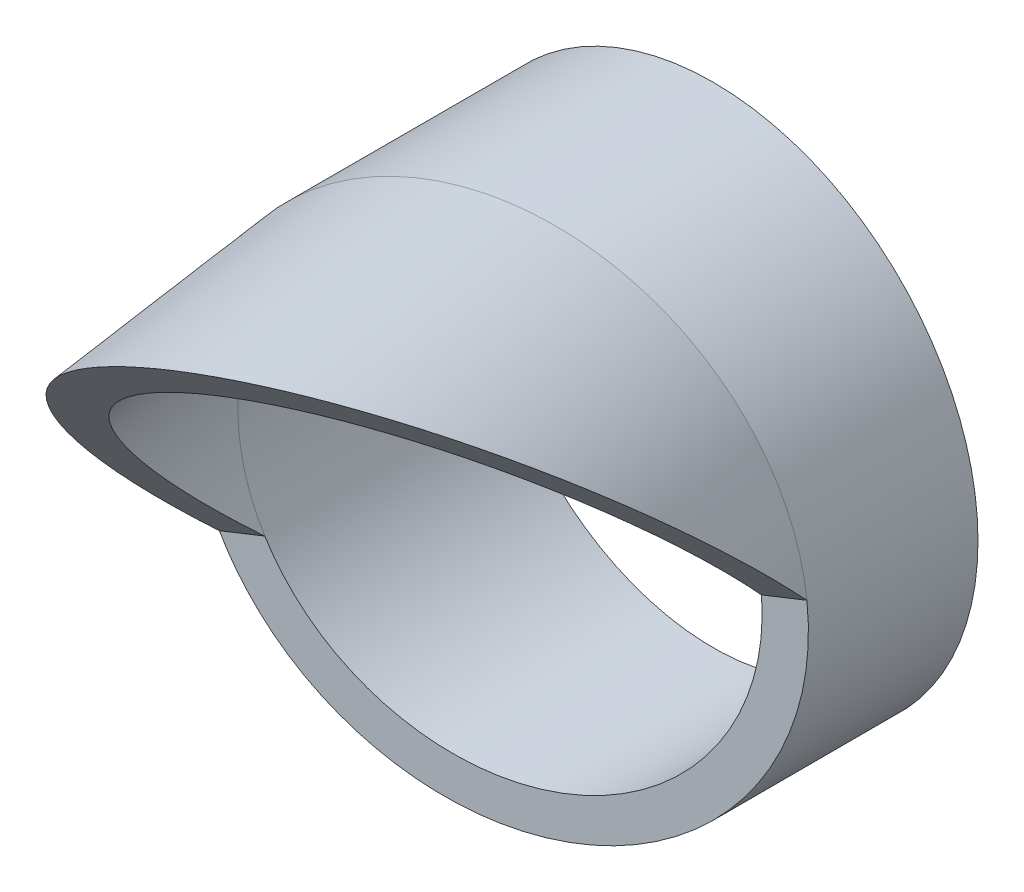
ISO-10303-21;
HEADER;
FILE_DESCRIPTION(('STEP AP214'),'2;1');
FILE_NAME('part.step','',(''),(''),'','','');
FILE_SCHEMA(('AUTOMOTIVE_DESIGN { 1 0 10303 214 1 1 1 1 }'));
ENDSEC;
DATA;
#1=APPLICATION_CONTEXT('core data for automotive mechanical design processes');
#2=APPLICATION_PROTOCOL_DEFINITION('international standard','automotive_design',2000,#1);
#3=PRODUCT_CONTEXT('',#1,'mechanical');
#4=PRODUCT('Part','Part','',(#3));
#5=PRODUCT_RELATED_PRODUCT_CATEGORY('part','',(#4));
#6=PRODUCT_DEFINITION_FORMATION('','',#4);
#7=PRODUCT_DEFINITION_CONTEXT('part definition',#1,'design');
#8=PRODUCT_DEFINITION('design','',#6,#7);
#9=PRODUCT_DEFINITION_SHAPE('','',#8);
#10=(LENGTH_UNIT() NAMED_UNIT(*) SI_UNIT(.MILLI.,.METRE.));
#11=(NAMED_UNIT(*) PLANE_ANGLE_UNIT() SI_UNIT($,.RADIAN.));
#12=(NAMED_UNIT(*) SI_UNIT($,.STERADIAN.) SOLID_ANGLE_UNIT());
#13=UNCERTAINTY_MEASURE_WITH_UNIT(LENGTH_MEASURE(1.E-05),#10,'distance_accuracy_value','');
#14=(GEOMETRIC_REPRESENTATION_CONTEXT(3) GLOBAL_UNCERTAINTY_ASSIGNED_CONTEXT((#13)) GLOBAL_UNIT_ASSIGNED_CONTEXT((#10,
#11,#12)) REPRESENTATION_CONTEXT('',''));
#15=CARTESIAN_POINT('',(0.,0.,0.));
#16=DIRECTION('',(0.,0.,1.));
#17=DIRECTION('',(1.,0.,0.));
#18=AXIS2_PLACEMENT_3D('',#15,#16,#17);
#19=CARTESIAN_POINT('',(159.020263581372,24.1294285061991,-220.702273573353));
#20=DIRECTION('',(-0.16261150339795,-0.0243941865043981,-0.986388575880442));
#21=DIRECTION('',(0.,-0.999694333772214,0.0247232486483956));
#22=AXIS2_PLACEMENT_3D('',#19,#20,#21);
#23=PLANE('',#22);
#24=DIRECTION('',(-0.946649738355044,-0.27803952145627,0.162936482657183));
#25=VECTOR('',#24,1.);
#26=CARTESIAN_POINT('',(0.910270861354675,-3.14163625511007,-193.962548779948));
#27=LINE('',#26,#25);
#28=CARTESIAN_POINT('',(-15.0845281279932,-7.83945222294123,-191.209538682822));
#29=VERTEX_POINT('',#28);
#30=CARTESIAN_POINT('',(-18.0093362344554,-8.69849460506376,-190.706123400479));
#31=VERTEX_POINT('',#30);
#32=EDGE_CURVE('E65',#29,#31,#27,.T.);
#33=ORIENTED_EDGE('',*,*,#32,.T.);
#34=CARTESIAN_POINT('',(0.,0.,-193.890180897479));
#35=DIRECTION('',(-0.16261150339795,-0.0243941865043981,-0.986388575880442));
#36=DIRECTION('',(0.975473354913011,0.146335766243945,-0.164431071797738));
#37=AXIS2_PLACEMENT_3D('',#34,#35,#36);
#38=ELLIPSE('',#37,20.2759850317084,20.);
#39=CARTESIAN_POINT('',(19.8528113921094,2.42195785044465,-197.222921441156));
#40=VERTEX_POINT('',#39);
#41=EDGE_CURVE('E69',#40,#31,#38,.T.);
#42=ORIENTED_EDGE('',*,*,#41,.F.);
#43=CARTESIAN_POINT('',(16.9280032856473,1.56291546832214,-196.719506158813));
#44=VERTEX_POINT('',#43);
#45=EDGE_CURVE('E73',#40,#44,#27,.T.);
#46=ORIENTED_EDGE('',*,*,#45,.T.);
#47=CARTESIAN_POINT('',(0.,0.,-193.890180897479));
#48=DIRECTION('',(-0.16261150339795,-0.0243941865043981,-0.986388575880442));
#49=DIRECTION('',(0.975473354913011,0.146335766243945,-0.164431071797738));
#50=AXIS2_PLACEMENT_3D('',#47,#48,#49);
#51=ELLIPSE('',#50,17.2345872769521,17.);
#52=EDGE_CURVE('E79',#44,#29,#51,.T.);
#53=ORIENTED_EDGE('',*,*,#52,.T.);
#54=EDGE_LOOP('',(#33,#42,#46,#53));
#55=FACE_BOUND('',#54,.T.);
#56=ADVANCED_FACE('F33',(#55),#23,.F.);
#57=CARTESIAN_POINT('',(0.,0.,-210.));
#58=DIRECTION('',(0.,0.,-1.));
#59=DIRECTION('',(1.,0.,0.));
#60=AXIS2_PLACEMENT_3D('',#57,#58,#59);
#61=PLANE('',#60);
#62=CARTESIAN_POINT('',(0.,0.,-210.));
#63=DIRECTION('',(0.,0.,-1.));
#64=DIRECTION('',(1.,0.,0.));
#65=AXIS2_PLACEMENT_3D('',#62,#63,#64);
#66=CIRCLE('',#65,20.);
#67=CARTESIAN_POINT('',(20.,0.,-210.));
#68=VERTEX_POINT('',#67);
#69=EDGE_CURVE('E11',#68,#68,#66,.T.);
#70=ORIENTED_EDGE('',*,*,#69,.T.);
#71=EDGE_LOOP('',(#70));
#72=FACE_BOUND('',#71,.T.);
#73=CARTESIAN_POINT('',(0.,0.,-210.));
#74=DIRECTION('',(0.,0.,-1.));
#75=DIRECTION('',(1.,0.,0.));
#76=AXIS2_PLACEMENT_3D('',#73,#74,#75);
#77=CIRCLE('',#76,17.);
#78=CARTESIAN_POINT('',(17.,0.,-210.));
#79=VERTEX_POINT('',#78);
#80=EDGE_CURVE('E41',#79,#79,#77,.T.);
#81=ORIENTED_EDGE('',*,*,#80,.F.);
#82=EDGE_LOOP('',(#81));
#83=FACE_BOUND('',#82,.T.);
#84=ADVANCED_FACE('F94',(#72,#83),#61,.T.);
#85=CARTESIAN_POINT('',(0.,0.,-210.));
#86=DIRECTION('',(0.,0.,1.));
#87=DIRECTION('',(-1.,0.,0.));
#88=AXIS2_PLACEMENT_3D('',#85,#86,#87);
#89=CYLINDRICAL_SURFACE('',#88,20.);
#90=ORIENTED_EDGE('',*,*,#69,.F.);
#91=EDGE_LOOP('',(#90));
#92=FACE_BOUND('',#91,.T.);
#93=ORIENTED_EDGE('',*,*,#41,.T.);
#94=EDGE_CURVE('E63',#31,#40,#38,.T.);
#95=ORIENTED_EDGE('',*,*,#94,.T.);
#96=EDGE_LOOP('',(#93,#95));
#97=FACE_BOUND('',#96,.T.);
#98=ADVANCED_FACE('F35',(#92,#97),#89,.T.);
#99=CARTESIAN_POINT('',(0.,0.,-210.));
#100=DIRECTION('',(0.,0.,1.));
#101=DIRECTION('',(-1.,0.,0.));
#102=AXIS2_PLACEMENT_3D('',#99,#100,#101);
#103=CYLINDRICAL_SURFACE('',#102,17.);
#104=ORIENTED_EDGE('',*,*,#80,.T.);
#105=EDGE_LOOP('',(#104));
#106=FACE_BOUND('',#105,.T.);
#107=ORIENTED_EDGE('',*,*,#52,.F.);
#108=EDGE_CURVE('E78',#29,#44,#51,.T.);
#109=ORIENTED_EDGE('',*,*,#108,.F.);
#110=EDGE_LOOP('',(#107,#109));
#111=FACE_BOUND('',#110,.T.);
#112=ADVANCED_FACE('F91',(#106,#111),#103,.F.);
#113=CARTESIAN_POINT('',(11.6426036892652,1.7465667548604,-123.267063635657));
#114=DIRECTION('',(0.16261150339795,0.0243941865043981,0.986388575880442));
#115=DIRECTION('',(0.97547335491301,0.146335766243947,-0.164431071797738));
#116=AXIS2_PLACEMENT_3D('',#113,#114,#115);
#117=ELLIPSE('',#116,17.2345872769521,17.);
#118=DIRECTION('',(-0.16261150339795,-0.0243941865043981,-0.986388575880442));
#119=VECTOR('',#118,1.);
#120=SURFACE_OF_LINEAR_EXTRUSION('',#117,#119);
#121=CARTESIAN_POINT('',(-15.0845281279933,-7.83945222294125,-191.209538682822));
#122=CARTESIAN_POINT('',(-15.1612871559029,-7.60982072736148,-190.956322702624));
#123=CARTESIAN_POINT('',(-15.232746514392,-7.37805778490534,-190.703471758801));
#124=CARTESIAN_POINT('',(-15.3650949812381,-6.91052197809102,-190.198727567382));
#125=CARTESIAN_POINT('',(-15.4259844312446,-6.6747492436113,-189.946834289088));
#126=CARTESIAN_POINT('',(-15.592835515124,-5.96182868254459,-189.192966400034));
#127=CARTESIAN_POINT('',(-15.6829977560138,-5.47902487003654,-188.692744622895));
#128=CARTESIAN_POINT('',(-15.8210783631236,-4.50060333773084,-187.699185164218));
#129=CARTESIAN_POINT('',(-15.868999204065,-4.00498637034588,-187.205847081063));
#130=CARTESIAN_POINT('',(-15.922254119359,-3.0028190814749,-186.227999660757));
#131=CARTESIAN_POINT('',(-15.927587197789,-2.49626850458216,-185.743490530337));
#132=CARTESIAN_POINT('',(-15.8949860998728,-1.47409772179016,-184.785382125877));
#133=CARTESIAN_POINT('',(-15.8570428829237,-0.958475642974025,-184.311785152522));
#134=CARTESIAN_POINT('',(-15.7368875187638,0.0796918860778796,-183.377996132474));
#135=CARTESIAN_POINT('',(-15.6546780266053,0.602236919247628,-182.917803283559));
#136=CARTESIAN_POINT('',(-15.4446273352371,1.65232854250528,-182.013267064877));
#137=CARTESIAN_POINT('',(-15.3167659946653,2.17987724001986,-181.568930786277));
#138=CARTESIAN_POINT('',(-15.0137435513342,3.23736060342348,-180.699350427098));
#139=CARTESIAN_POINT('',(-14.8385751180095,3.76729562656551,-180.27410931737));
#140=CARTESIAN_POINT('',(-14.4399606658589,4.82397599651774,-179.448467451121));
#141=CARTESIAN_POINT('',(-14.2167522642605,5.35072437312303,-179.047956490908));
#142=CARTESIAN_POINT('',(-13.7195027496257,6.39982821453472,-178.274074107531));
#143=CARTESIAN_POINT('',(-13.4454914610039,6.92218606973304,-177.900686939117));
#144=CARTESIAN_POINT('',(-12.8929395495552,7.87450959023015,-177.24389089397));
#145=CARTESIAN_POINT('',(-12.6222965247528,8.305756495543,-176.955695659321));
#146=CARTESIAN_POINT('',(-12.0418973119752,9.159672940856,-176.405134056145));
#147=CARTESIAN_POINT('',(-11.732085631783,9.58232930423376,-176.142805291366));
#148=CARTESIAN_POINT('',(-11.1153005476024,10.3605504738459,-175.68071903837));
#149=CARTESIAN_POINT('',(-10.8131395706409,10.7177241336275,-175.477256813521));
#150=CARTESIAN_POINT('',(-10.1781564578294,11.4189452839543,-175.096673113593));
#151=CARTESIAN_POINT('',(-9.84532507882441,11.7629887729864,-174.919559621567));
#152=CARTESIAN_POINT('',(-9.14938788479223,12.4338723000489,-174.595379203276));
#153=CARTESIAN_POINT('',(-8.78630659824536,12.7607259324973,-174.448288260448));
#154=CARTESIAN_POINT('',(-8.2197746562536,13.2348395614639,-174.25293401351));
#155=CARTESIAN_POINT('',(-8.02730497183945,13.3901641730573,-174.192035786239));
#156=CARTESIAN_POINT('',(-7.635158391571,13.6949437167719,-174.079080840661));
#157=CARTESIAN_POINT('',(-7.43547973360226,13.8443971948935,-174.027026302033));
#158=CARTESIAN_POINT('',(-6.93536458773089,14.2043341985136,-173.910340378622));
#159=CARTESIAN_POINT('',(-6.63099133829881,14.4111199666548,-173.851006311768));
#160=CARTESIAN_POINT('',(-6.00878749966731,14.8087090317113,-173.753627234234));
#161=CARTESIAN_POINT('',(-5.69096005941402,14.9995160376504,-173.715577271331));
#162=CARTESIAN_POINT('',(-5.04358489445133,15.3631143379302,-173.661916958458));
#163=CARTESIAN_POINT('',(-4.71404560018038,15.5359182526138,-173.646290789684));
#164=CARTESIAN_POINT('',(-4.04503877552471,15.861790088766,-173.638305931259));
#165=CARTESIAN_POINT('',(-3.70557101619056,16.0148575546731,-173.645947778586));
#166=CARTESIAN_POINT('',(-3.01771078875665,16.3001639723234,-173.685085495143));
#167=CARTESIAN_POINT('',(-2.66928794146475,16.4323167632501,-173.716677087189));
#168=CARTESIAN_POINT('',(-1.96753615035512,16.6736952750359,-173.803896544597));
#169=CARTESIAN_POINT('',(-1.61420721510919,16.7829210359472,-173.85952436797));
#170=CARTESIAN_POINT('',(-0.905498153477816,16.9775176641538,-173.994409905649));
#171=CARTESIAN_POINT('',(-0.550118005519053,17.0628882800879,-174.073667868928));
#172=CARTESIAN_POINT('',(0.159824285620206,17.2093191323935,-174.254951310848));
#173=CARTESIAN_POINT('',(0.51438644622412,17.2703798914166,-174.356976299933));
#174=CARTESIAN_POINT('',(1.19974580243548,17.3654196533928,-174.576067376226));
#175=CARTESIAN_POINT('',(1.53074084850884,17.4007496649581,-174.691937024612));
#176=CARTESIAN_POINT('',(2.18751352856145,17.4502197644824,-174.9414870005));
#177=CARTESIAN_POINT('',(2.51329149933997,17.4643612258128,-175.075166173035));
#178=CARTESIAN_POINT('',(3.15798699603002,17.4721277431897,-175.358952110279));
#179=CARTESIAN_POINT('',(3.47690180008594,17.4657448051186,-175.509065253915));
#180=CARTESIAN_POINT('',(4.10629198212578,17.4333385769174,-175.824172216427));
#181=CARTESIAN_POINT('',(4.4167657358072,17.4073115340207,-175.989168873313));
#182=CARTESIAN_POINT('',(5.13054742873233,17.3247914602107,-176.390086329226));
#183=CARTESIAN_POINT('',(5.53009159294359,17.2610109129039,-176.631242977437));
#184=CARTESIAN_POINT('',(6.30991526959753,17.1029383600173,-177.133894102092));
#185=CARTESIAN_POINT('',(6.69018835721479,17.008636255188,-177.395395288535));
#186=CARTESIAN_POINT('',(7.4303318011825,16.7922020585684,-177.935669432241));
#187=CARTESIAN_POINT('',(7.79018780110574,16.6700506799525,-178.214454261295));
#188=CARTESIAN_POINT('',(8.48836779710209,16.4006568036998,-178.786178984248));
#189=CARTESIAN_POINT('',(8.8266963287434,16.2534196155311,-179.079115873451));
#190=CARTESIAN_POINT('',(9.58884807068831,15.8843786040723,-179.774570896888));
#191=CARTESIAN_POINT('',(10.0044153420226,15.6539411143142,-180.181577162692));
#192=CARTESIAN_POINT('',(10.7967427494077,15.1586895391893,-181.010779709015));
#193=CARTESIAN_POINT('',(11.1735461976943,14.8939145851528,-181.43295830902));
#194=CARTESIAN_POINT('',(11.8891454060059,14.334476728832,-182.288594605332));
#195=CARTESIAN_POINT('',(12.227975968502,14.0398416732005,-182.722041517669));
#196=CARTESIAN_POINT('',(12.8688661915242,13.4241952805671,-183.597430868772));
#197=CARTESIAN_POINT('',(13.1709157783734,13.1031767577283,-184.03937559674));
#198=CARTESIAN_POINT('',(13.7387116702788,12.4383556863261,-184.928552915414));
#199=CARTESIAN_POINT('',(14.0044900638168,12.0945736814576,-185.375780446832));
#200=CARTESIAN_POINT('',(14.500817387675,11.3867550409157,-186.27360105769));
#201=CARTESIAN_POINT('',(14.7313690634157,11.0227199866984,-186.724193871979));
#202=CARTESIAN_POINT('',(15.1578627373145,10.2768705823322,-187.626669119958));
#203=CARTESIAN_POINT('',(15.3538194791603,9.89506389420254,-188.078550920465));
#204=CARTESIAN_POINT('',(15.7117536971459,9.11566295668559,-188.981993269444));
#205=CARTESIAN_POINT('',(15.8737301423106,8.71806822871834,-189.433553807755));
#206=CARTESIAN_POINT('',(16.3092525830642,7.5043529942296,-190.785389833928));
#207=CARTESIAN_POINT('',(16.5326708895887,6.66680645451487,-191.683416927475));
#208=CARTESIAN_POINT('',(16.7515473075699,5.46766564409457,-192.92353354142));
#209=CARTESIAN_POINT('',(16.8032102593787,5.12384621370988,-193.274091167035));
#210=CARTESIAN_POINT('',(16.8855371106341,4.43003067678881,-193.971600709148));
#211=CARTESIAN_POINT('',(16.9162027996414,4.08003509924356,-194.318552930446));
#212=CARTESIAN_POINT('',(16.9565626783665,3.37168246685857,-195.010943453661));
#213=CARTESIAN_POINT('',(16.9660814689282,3.01328021569242,-195.35634555111));
#214=CARTESIAN_POINT('',(16.9633964195216,2.29158516047595,-196.041993187062));
#215=CARTESIAN_POINT('',(16.9511902064843,1.92829182646406,-196.382238158147));
#216=CARTESIAN_POINT('',(16.9280032856471,1.56291546832212,-196.719506158813));
#217=B_SPLINE_CURVE_WITH_KNOTS('',3,(#121,#122,#123,#124,#125,#126,#127,#128,#129,#130,#131,
#132,#133,#134,#135,#136,#137,#138,#139,#140,#141,#142,#143,#144,#145,#146,#147,#148,#149,#150,
#151,#152,#153,#154,#155,#156,#157,#158,#159,#160,#161,#162,#163,#164,#165,#166,#167,#168,#169,
#170,#171,#172,#173,#174,#175,#176,#177,#178,#179,#180,#181,#182,#183,#184,#185,#186,#187,#188,
#189,#190,#191,#192,#193,#194,#195,#196,#197,#198,#199,#200,#201,#202,#203,#204,#205,#206,#207,
#208,#209,#210,#211,#212,#213,#214,#215,#216),.UNSPECIFIED.,.F.,.F.,(4,2,2,2,2,2,2,2,2,2,2,2,2,
2,2,2,2,2,2,2,2,2,2,2,2,2,2,2,2,2,2,2,2,2,2,2,2,2,2,2,2,2,2,2,2,2,2,4),(0.,1.05093126493316,
2.10182855444848,4.20337822235659,6.30480476234851,8.40628044444371,10.5081952142103,
12.6099839270158,14.7127010864378,16.8157442637531,18.9086150125485,21.0002609858475,
22.7536729473739,24.50959749412,26.0384847992218,27.5678343822503,29.0959557240447,
29.8598214161952,30.6238751039285,31.7408590360559,32.8575829686848,33.9735187235484,
35.0894802321028,36.2099257081804,37.3303692268902,38.4508245512514,39.5712557849973,
40.6275028117566,41.683681373128,42.7402713588771,43.7970632443677,45.208066666486,
46.6195374523415,48.0319887280771,49.4441414258479,51.3184377468357,53.190616567806,
55.0610652410004,56.9320250511872,58.8013187752334,60.6704667400935,62.5388161772904,
64.4072222927186,68.1415757917394,69.6224750652952,71.1032481086359,72.5962580130949,
74.0894310122615),.UNSPECIFIED.);
#218=EDGE_CURVE('E55',#29,#44,#217,.T.);
#219=ORIENTED_EDGE('',*,*,#218,.F.);
#220=ORIENTED_EDGE('',*,*,#108,.T.);
#221=EDGE_LOOP('',(#219,#220));
#222=FACE_BOUND('',#221,.T.);
#223=ADVANCED_FACE('F105',(#222),#120,.T.);
#224=CARTESIAN_POINT('',(11.6426036892652,1.7465667548604,-123.267063635657));
#225=DIRECTION('',(0.16261150339795,0.0243941865043981,0.986388575880442));
#226=DIRECTION('',(0.97547335491301,0.146335766243949,-0.164431071797738));
#227=AXIS2_PLACEMENT_3D('',#224,#225,#226);
#228=ELLIPSE('',#227,20.2759850317084,20.);
#229=DIRECTION('',(-0.16261150339795,-0.0243941865043981,-0.986388575880442));
#230=VECTOR('',#229,1.);
#231=SURFACE_OF_LINEAR_EXTRUSION('',#228,#230);
#232=CARTESIAN_POINT('',(-18.0093362344556,-8.6984946050638,-190.706123400479));
#233=CARTESIAN_POINT('',(-18.0914126977776,-8.42508600412158,-190.408841717572));
#234=CARTESIAN_POINT('',(-18.1672708315402,-8.1492829563104,-190.112089679586));
#235=CARTESIAN_POINT('',(-18.306570293442,-7.59317418992524,-189.519908334189));
#236=CARTESIAN_POINT('',(-18.3700119641423,-7.31286859580419,-189.224478990505));
#237=CARTESIAN_POINT('',(-18.5417405274645,-6.46564299976824,-188.340585769938));
#238=CARTESIAN_POINT('',(-18.6314421643314,-5.89237680219161,-187.754476070557));
#239=CARTESIAN_POINT('',(-18.7610489110115,-4.73152751430538,-186.591121493443));
#240=CARTESIAN_POINT('',(-18.8009557512912,-4.14394492224204,-186.013876308339));
#241=CARTESIAN_POINT('',(-18.8304437980178,-2.95668178662346,-184.870601569143));
#242=CARTESIAN_POINT('',(-18.8200248362866,-2.35700120264598,-184.304572052538));
#243=CARTESIAN_POINT('',(-18.7479357658123,-1.14770244466511,-183.18620274493));
#244=CARTESIAN_POINT('',(-18.6862520065336,-0.538081666227573,-182.633866640487));
#245=CARTESIAN_POINT('',(-18.5103294531923,0.688481179263036,-181.54596307786));
#246=CARTESIAN_POINT('',(-18.3960942834567,1.30542273856376,-181.010394465989));
#247=CARTESIAN_POINT('',(-18.113310961874,2.54435657780216,-179.958980840166));
#248=CARTESIAN_POINT('',(-17.9447317958212,3.16635154366011,-179.443147277545));
#249=CARTESIAN_POINT('',(-17.551203732757,4.41200928488282,-178.435352308658));
#250=CARTESIAN_POINT('',(-17.3262533028267,5.03567210514565,-177.943391552005));
#251=CARTESIAN_POINT('',(-16.825496943313,6.2615888690173,-177.002814507844));
#252=CARTESIAN_POINT('',(-16.5514904024456,6.86390535991193,-176.553325995763));
#253=CARTESIAN_POINT('',(-15.945891181311,8.06249728991104,-175.686107291111));
#254=CARTESIAN_POINT('',(-15.6143086922696,8.65877377839075,-175.268371496935));
#255=CARTESIAN_POINT('',(-14.9489065476288,9.74572787637671,-174.534412169464));
#256=CARTESIAN_POINT('',(-14.6239094081069,10.2380554420419,-174.212633618793));
#257=CARTESIAN_POINT('',(-13.9301536755605,11.2110638127268,-173.59992603213));
#258=CARTESIAN_POINT('',(-13.5614006609852,11.6917460930183,-173.308993072562));
#259=CARTESIAN_POINT('',(-12.8342384981728,12.5702709166173,-172.801296568279));
#260=CARTESIAN_POINT('',(-12.4816780406918,12.9702509116543,-172.579857173185));
#261=CARTESIAN_POINT('',(-11.7433836584535,13.7545434715212,-172.166872419813));
#262=CARTESIAN_POINT('',(-11.3576649951123,14.138863125398,-171.975313421823));
#263=CARTESIAN_POINT('',(-10.6036770340226,14.8409643122262,-171.647640861384));
#264=CARTESIAN_POINT('',(-10.2392686478515,15.1610524108527,-171.507588280505));
#265=CARTESIAN_POINT('',(-9.48556395196988,15.7834588859927,-171.255635797348));
#266=CARTESIAN_POINT('',(-9.09624342902343,16.0857594090387,-171.143763822728));
#267=CARTESIAN_POINT('',(-8.32919246949368,16.6435603309999,-170.9593263754));
#268=CARTESIAN_POINT('',(-7.95337912765778,16.9008463937875,-170.884195570686));
#269=CARTESIAN_POINT('',(-7.18391329461154,17.39482778599,-170.761587898542));
#270=CARTESIAN_POINT('',(-6.79025633389335,17.6315179126574,-170.714118001393));
#271=CARTESIAN_POINT('',(-5.98727339833533,18.0815748329746,-170.648452702667));
#272=CARTESIAN_POINT('',(-5.57794293488206,18.2949348768242,-170.630265752379));
#273=CARTESIAN_POINT('',(-4.74654583796205,18.6956606735071,-170.624383760855));
#274=CARTESIAN_POINT('',(-4.32448062912198,18.8830293209486,-170.636685321292));
#275=CARTESIAN_POINT('',(-3.48434912143232,19.2240871716906,-170.691536136844));
#276=CARTESIAN_POINT('',(-3.06657502242091,19.3786507517038,-170.733121247137));
#277=CARTESIAN_POINT('',(-2.22553307004792,19.6597000438344,-170.845495337055));
#278=CARTESIAN_POINT('',(-1.8022652210585,19.7861857782959,-170.916284293439));
#279=CARTESIAN_POINT('',(-0.95392902220078,20.009975723801,-171.086448397056));
#280=CARTESIAN_POINT('',(-0.528861298030127,20.1072893469545,-171.185814303885));
#281=CARTESIAN_POINT('',(0.319687287675332,20.2723290343489,-171.411988838152));
#282=CARTESIAN_POINT('',(0.743168195736907,20.3400559729336,-171.538796654462));
#283=CARTESIAN_POINT('',(1.55494098650956,20.4422554345733,-171.808168411186));
#284=CARTESIAN_POINT('',(1.943574119211,20.4787684712115,-171.948944455359));
#285=CARTESIAN_POINT('',(2.71423665624357,20.5269648247242,-172.251145202022));
#286=CARTESIAN_POINT('',(3.09626657564217,20.5386500869768,-172.412568285664));
#287=CARTESIAN_POINT('',(3.85186365208333,20.538042395987,-172.754413072153));
#288=CARTESIAN_POINT('',(4.22542732667709,20.5257397505223,-172.934842426545));
#289=CARTESIAN_POINT('',(4.96229885852962,20.478232250068,-173.312865849449));
#290=CARTESIAN_POINT('',(5.32560471943408,20.4430229686584,-173.510463229071));
#291=CARTESIAN_POINT('',(6.1656744501094,20.3348253046889,-173.9928570322));
#292=CARTESIAN_POINT('',(6.63768272653837,20.2529310218233,-174.283981616726));
#293=CARTESIAN_POINT('',(7.55818778390879,20.052952280045,-174.89005513931));
#294=CARTESIAN_POINT('',(8.00667649505089,19.9348554936047,-175.205012165135));
#295=CARTESIAN_POINT('',(8.87889665706202,19.6657223368224,-175.855094226136));
#296=CARTESIAN_POINT('',(9.30260976514822,19.5146619435682,-176.190233840147));
#297=CARTESIAN_POINT('',(10.1240056306982,19.1829099369844,-176.876957408552));
#298=CARTESIAN_POINT('',(10.5216939234507,19.0022246535005,-177.22853783865));
#299=CARTESIAN_POINT('',(11.4178079770292,18.5501076783343,-178.063563179266));
#300=CARTESIAN_POINT('',(11.9061906090425,18.2684024658349,-178.552249736682));
#301=CARTESIAN_POINT('',(12.8361305393571,17.6643905432176,-179.547115875204));
#302=CARTESIAN_POINT('',(13.2777406989721,17.3421305887973,-180.053274832295));
#303=CARTESIAN_POINT('',(14.1151839210673,16.6623550585854,-181.078471365649));
#304=CARTESIAN_POINT('',(14.5110585733738,16.3048720700887,-181.597496711639));
#305=CARTESIAN_POINT('',(15.2585478903115,15.5588166868304,-182.645146106697));
#306=CARTESIAN_POINT('',(15.6101500702579,15.1702355728059,-183.173772815444));
#307=CARTESIAN_POINT('',(16.2696880153103,14.3662543101469,-184.236828774247));
#308=CARTESIAN_POINT('',(16.5776616606627,13.9508778881999,-184.771252551516));
#309=CARTESIAN_POINT('',(17.1512104367658,13.0963065988365,-185.843619539229));
#310=CARTESIAN_POINT('',(17.416789747842,12.6571140855528,-186.381562397219));
#311=CARTESIAN_POINT('',(17.906273570856,11.7578746982732,-187.458473398849));
#312=CARTESIAN_POINT('',(18.1301964669282,11.297837135785,-187.997440983648));
#313=CARTESIAN_POINT('',(18.5371463160348,10.3591274445839,-189.074640560652));
#314=CARTESIAN_POINT('',(18.7201689474261,9.88045335294879,-189.612872469156));
#315=CARTESIAN_POINT('',(19.0641247074185,8.85157653011733,-190.747435634276));
#316=CARTESIAN_POINT('',(19.2202192388793,8.2994064129595,-191.343453956388));
#317=CARTESIAN_POINT('',(19.4824620704874,7.17749068946812,-192.529659475634));
#318=CARTESIAN_POINT('',(19.588618254737,6.60774787259927,-193.11984757881));
#319=CARTESIAN_POINT('',(19.7521662791646,5.44432767716411,-194.300978594504));
#320=CARTESIAN_POINT('',(19.8088036212347,4.85041958470697,-194.891800314758));
#321=CARTESIAN_POINT('',(19.8548557198691,3.94845442897773,-195.771028987873));
#322=CARTESIAN_POINT('',(19.8636992337057,3.64528422258165,-196.063559986372));
#323=CARTESIAN_POINT('',(19.8681847282916,3.03585771496156,-196.645596628816));
#324=CARTESIAN_POINT('',(19.8638244357224,2.72960089135782,-196.93510174318));
#325=CARTESIAN_POINT('',(19.8528113921094,2.42195785044464,-197.222921441156));
#326=B_SPLINE_CURVE_WITH_KNOTS('',3,(#232,#233,#234,#235,#236,#237,#238,#239,#240,#241,#242,
#243,#244,#245,#246,#247,#248,#249,#250,#251,#252,#253,#254,#255,#256,#257,#258,#259,#260,#261,
#262,#263,#264,#265,#266,#267,#268,#269,#270,#271,#272,#273,#274,#275,#276,#277,#278,#279,#280,
#281,#282,#283,#284,#285,#286,#287,#288,#289,#290,#291,#292,#293,#294,#295,#296,#297,#298,#299,
#300,#301,#302,#303,#304,#305,#306,#307,#308,#309,#310,#311,#312,#313,#314,#315,#316,#317,#318,
#319,#320,#321,#322,#323,#324,#325),.UNSPECIFIED.,.F.,.F.,(4,2,2,2,2,2,2,2,2,2,2,2,2,2,2,2,2,2,
2,2,2,2,2,2,2,2,2,2,2,2,2,2,2,2,2,2,2,2,2,2,2,2,2,2,2,2,4),(0.,1.23632487929271,
2.47261564446971,4.94502848138211,7.41735539471766,9.88969057004801,12.3626842775037,
14.8355074549132,17.3097443823259,19.7840485996226,22.1813940052684,24.5783155007561,
26.592259599136,28.6059472145071,30.336221542641,32.0657037143657,33.5786674672308,
35.0931247563823,36.4764012018061,37.8600260689261,39.2440501895799,40.6279200503682,
41.9682365429206,43.3085519688567,44.6484344879295,45.9882774081985,47.2318059645524,
48.4752370807418,49.7191707046259,50.9633447745,52.6426344050289,54.3224964967345,
56.0035869358638,57.6843186493137,59.919465609672,62.1520588726294,64.3826056631321,
66.6137800581247,68.8430052161838,71.0720104238298,73.3000295635728,75.5282840112294,
78.0085231595679,80.4883706043617,83.0053750789527,84.2693306837628,85.5335039180141),.UNSPECIFIED.);
#327=EDGE_CURVE('E48',#31,#40,#326,.T.);
#328=ORIENTED_EDGE('',*,*,#327,.T.);
#329=ORIENTED_EDGE('',*,*,#94,.F.);
#330=EDGE_LOOP('',(#328,#329));
#331=FACE_BOUND('',#330,.T.);
#332=ADVANCED_FACE('F62',(#331),#231,.F.);
#333=CARTESIAN_POINT('',(151.969388338791,57.82974309489,-204.160182485789));
#334=DIRECTION('',(-0.310945598507739,0.65523310047211,-0.688463810824047));
#335=DIRECTION('',(0.,-0.724372619296341,-0.689408665751859));
#336=AXIS2_PLACEMENT_3D('',#333,#334,#335);
#337=PLANE('',#336);
#338=ORIENTED_EDGE('',*,*,#32,.F.);
#339=ORIENTED_EDGE('',*,*,#218,.T.);
#340=ORIENTED_EDGE('',*,*,#45,.F.);
#341=ORIENTED_EDGE('',*,*,#327,.F.);
#342=EDGE_LOOP('',(#338,#339,#340,#341));
#343=FACE_BOUND('',#342,.T.);
#344=ADVANCED_FACE('F74',(#343),#337,.F.);
#345=CLOSED_SHELL('',(#56,#84,#98,#112,#223,#332,#344));
#346=MANIFOLD_SOLID_BREP('B2',#345);
#347=ADVANCED_BREP_SHAPE_REPRESENTATION('',(#18,#346),#14);
#348=SHAPE_DEFINITION_REPRESENTATION(#9,#347);
ENDSEC;
END-ISO-10303-21;
